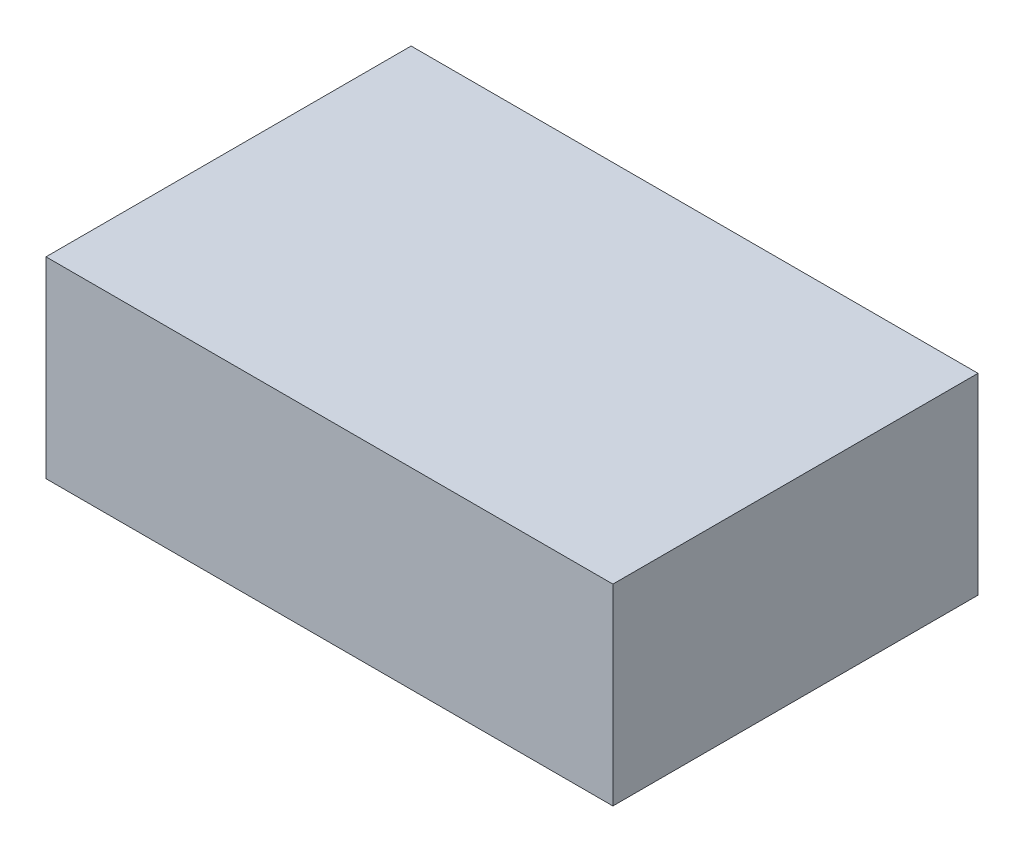
ISO-10303-21;
HEADER;
FILE_DESCRIPTION(('STEP AP214'),'2;1');
FILE_NAME('part.step','',(''),(''),'','','');
FILE_SCHEMA(('AUTOMOTIVE_DESIGN { 1 0 10303 214 1 1 1 1 }'));
ENDSEC;
DATA;
#1=APPLICATION_CONTEXT('core data for automotive mechanical design processes');
#2=APPLICATION_PROTOCOL_DEFINITION('international standard','automotive_design',2000,#1);
#3=PRODUCT_CONTEXT('',#1,'mechanical');
#4=PRODUCT('Part','Part','',(#3));
#5=PRODUCT_RELATED_PRODUCT_CATEGORY('part','',(#4));
#6=PRODUCT_DEFINITION_FORMATION('','',#4);
#7=PRODUCT_DEFINITION_CONTEXT('part definition',#1,'design');
#8=PRODUCT_DEFINITION('design','',#6,#7);
#9=PRODUCT_DEFINITION_SHAPE('','',#8);
#10=(LENGTH_UNIT() NAMED_UNIT(*) SI_UNIT(.MILLI.,.METRE.));
#11=(NAMED_UNIT(*) PLANE_ANGLE_UNIT() SI_UNIT($,.RADIAN.));
#12=(NAMED_UNIT(*) SI_UNIT($,.STERADIAN.) SOLID_ANGLE_UNIT());
#13=UNCERTAINTY_MEASURE_WITH_UNIT(LENGTH_MEASURE(1.E-05),#10,'distance_accuracy_value','');
#14=(GEOMETRIC_REPRESENTATION_CONTEXT(3) GLOBAL_UNCERTAINTY_ASSIGNED_CONTEXT((#13)) GLOBAL_UNIT_ASSIGNED_CONTEXT((#10,
#11,#12)) REPRESENTATION_CONTEXT('',''));
#15=CARTESIAN_POINT('',(0.,0.,0.));
#16=DIRECTION('',(0.,0.,1.));
#17=DIRECTION('',(1.,0.,0.));
#18=AXIS2_PLACEMENT_3D('',#15,#16,#17);
#19=CARTESIAN_POINT('',(746.125,-254.,-838.2));
#20=DIRECTION('',(0.,0.,-1.));
#21=DIRECTION('',(-1.,0.,0.));
#22=AXIS2_PLACEMENT_3D('',#19,#20,#21);
#23=PLANE('',#22);
#24=DIRECTION('',(-1.,0.,0.));
#25=VECTOR('',#24,1.);
#26=CARTESIAN_POINT('',(746.125,-254.,-838.2));
#27=LINE('',#26,#25);
#28=CARTESIAN_POINT('',(746.125,-254.,-838.2));
#29=VERTEX_POINT('',#28);
#30=CARTESIAN_POINT('',(-746.125,-254.,-838.2));
#31=VERTEX_POINT('',#30);
#32=EDGE_CURVE('E34',#29,#31,#27,.T.);
#33=ORIENTED_EDGE('',*,*,#32,.F.);
#34=DIRECTION('',(0.,1.,0.));
#35=VECTOR('',#34,1.);
#36=CARTESIAN_POINT('',(746.125,-254.,-838.2));
#37=LINE('',#36,#35);
#38=CARTESIAN_POINT('',(746.125,-250.825,-838.2));
#39=VERTEX_POINT('',#38);
#40=EDGE_CURVE('E10',#29,#39,#37,.T.);
#41=ORIENTED_EDGE('',*,*,#40,.T.);
#42=DIRECTION('',(1.,0.,0.));
#43=VECTOR('',#42,1.);
#44=CARTESIAN_POINT('',(-746.125,-250.825,-838.2));
#45=LINE('',#44,#43);
#46=CARTESIAN_POINT('',(-746.125,-250.825,-838.2));
#47=VERTEX_POINT('',#46);
#48=EDGE_CURVE('E138',#47,#39,#45,.T.);
#49=ORIENTED_EDGE('',*,*,#48,.F.);
#50=DIRECTION('',(0.,1.,0.));
#51=VECTOR('',#50,1.);
#52=CARTESIAN_POINT('',(-746.125,-254.,-838.2));
#53=LINE('',#52,#51);
#54=EDGE_CURVE('E141',#31,#47,#53,.T.);
#55=ORIENTED_EDGE('',*,*,#54,.F.);
#56=EDGE_LOOP('',(#33,#41,#49,#55));
#57=FACE_BOUND('',#56,.T.);
#58=ADVANCED_FACE('F16',(#57),#23,.F.);
#59=CARTESIAN_POINT('',(-746.125,-254.,-127.));
#60=DIRECTION('',(0.,0.,1.));
#61=DIRECTION('',(1.,0.,0.));
#62=AXIS2_PLACEMENT_3D('',#59,#60,#61);
#63=PLANE('',#62);
#64=DIRECTION('',(1.,0.,0.));
#65=VECTOR('',#64,1.);
#66=CARTESIAN_POINT('',(-746.125,-254.,-127.));
#67=LINE('',#66,#65);
#68=CARTESIAN_POINT('',(-746.125,-254.,-127.));
#69=VERTEX_POINT('',#68);
#70=CARTESIAN_POINT('',(746.125,-254.,-127.));
#71=VERTEX_POINT('',#70);
#72=EDGE_CURVE('E135',#69,#71,#67,.T.);
#73=ORIENTED_EDGE('',*,*,#72,.F.);
#74=DIRECTION('',(0.,1.,0.));
#75=VECTOR('',#74,1.);
#76=CARTESIAN_POINT('',(-746.125,-254.,-127.));
#77=LINE('',#76,#75);
#78=CARTESIAN_POINT('',(-746.125,-250.825,-127.));
#79=VERTEX_POINT('',#78);
#80=EDGE_CURVE('E26',#69,#79,#77,.T.);
#81=ORIENTED_EDGE('',*,*,#80,.T.);
#82=DIRECTION('',(-1.,0.,0.));
#83=VECTOR('',#82,1.);
#84=CARTESIAN_POINT('',(746.125,-250.825,-127.));
#85=LINE('',#84,#83);
#86=CARTESIAN_POINT('',(746.125,-250.825,-127.));
#87=VERTEX_POINT('',#86);
#88=EDGE_CURVE('E148',#87,#79,#85,.T.);
#89=ORIENTED_EDGE('',*,*,#88,.F.);
#90=DIRECTION('',(0.,1.,0.));
#91=VECTOR('',#90,1.);
#92=CARTESIAN_POINT('',(746.125,-254.,-127.));
#93=LINE('',#92,#91);
#94=EDGE_CURVE('E152',#71,#87,#93,.T.);
#95=ORIENTED_EDGE('',*,*,#94,.F.);
#96=EDGE_LOOP('',(#73,#81,#89,#95));
#97=FACE_BOUND('',#96,.T.);
#98=ADVANCED_FACE('F220',(#97),#63,.F.);
#99=CARTESIAN_POINT('',(749.3,-250.825,0.));
#100=DIRECTION('',(0.,-1.,0.));
#101=DIRECTION('',(0.,0.,-1.));
#102=AXIS2_PLACEMENT_3D('',#99,#100,#101);
#103=PLANE('',#102);
#104=ORIENTED_EDGE('',*,*,#48,.T.);
#105=DIRECTION('',(0.,0.,-1.));
#106=VECTOR('',#105,1.);
#107=CARTESIAN_POINT('',(746.125,-250.825,-838.2));
#108=LINE('',#107,#106);
#109=CARTESIAN_POINT('',(746.125,-250.825,-962.025));
#110=VERTEX_POINT('',#109);
#111=EDGE_CURVE('E140',#39,#110,#108,.T.);
#112=ORIENTED_EDGE('',*,*,#111,.T.);
#113=DIRECTION('',(-1.,0.,0.));
#114=VECTOR('',#113,1.);
#115=CARTESIAN_POINT('',(746.125,-250.825,-962.025));
#116=LINE('',#115,#114);
#117=CARTESIAN_POINT('',(-746.125,-250.825,-962.025));
#118=VERTEX_POINT('',#117);
#119=EDGE_CURVE('E150',#110,#118,#116,.T.);
#120=ORIENTED_EDGE('',*,*,#119,.T.);
#121=DIRECTION('',(0.,0.,-1.));
#122=VECTOR('',#121,1.);
#123=CARTESIAN_POINT('',(-746.125,-250.825,-962.025));
#124=LINE('',#123,#122);
#125=EDGE_CURVE('E144',#47,#118,#124,.T.);
#126=ORIENTED_EDGE('',*,*,#125,.F.);
#127=EDGE_LOOP('',(#104,#112,#120,#126));
#128=FACE_BOUND('',#127,.T.);
#129=ADVANCED_FACE('F225',(#128),#103,.F.);
#130=CARTESIAN_POINT('',(749.3,-250.825,0.));
#131=DIRECTION('',(0.,-1.,0.));
#132=DIRECTION('',(0.,0.,-1.));
#133=AXIS2_PLACEMENT_3D('',#130,#131,#132);
#134=PLANE('',#133);
#135=ORIENTED_EDGE('',*,*,#88,.T.);
#136=DIRECTION('',(0.,0.,-1.));
#137=VECTOR('',#136,1.);
#138=CARTESIAN_POINT('',(-746.125,-250.825,-127.));
#139=LINE('',#138,#137);
#140=CARTESIAN_POINT('',(-746.125,-250.825,-3.175));
#141=VERTEX_POINT('',#140);
#142=EDGE_CURVE('E143',#141,#79,#139,.T.);
#143=ORIENTED_EDGE('',*,*,#142,.F.);
#144=DIRECTION('',(1.,0.,0.));
#145=VECTOR('',#144,1.);
#146=CARTESIAN_POINT('',(746.125,-250.825,-3.175));
#147=LINE('',#146,#145);
#148=CARTESIAN_POINT('',(746.125,-250.825,-3.175));
#149=VERTEX_POINT('',#148);
#150=EDGE_CURVE('E151',#141,#149,#147,.T.);
#151=ORIENTED_EDGE('',*,*,#150,.T.);
#152=DIRECTION('',(0.,0.,-1.));
#153=VECTOR('',#152,1.);
#154=CARTESIAN_POINT('',(746.125,-250.825,-3.175));
#155=LINE('',#154,#153);
#156=EDGE_CURVE('E167',#149,#87,#155,.T.);
#157=ORIENTED_EDGE('',*,*,#156,.T.);
#158=EDGE_LOOP('',(#135,#143,#151,#157));
#159=FACE_BOUND('',#158,.T.);
#160=ADVANCED_FACE('F231',(#159),#134,.F.);
#161=CARTESIAN_POINT('',(746.125,254.,0.));
#162=DIRECTION('',(1.,0.,0.));
#163=DIRECTION('',(0.,0.,-1.));
#164=AXIS2_PLACEMENT_3D('',#161,#162,#163);
#165=PLANE('',#164);
#166=DIRECTION('',(0.,1.,0.));
#167=VECTOR('',#166,1.);
#168=CARTESIAN_POINT('',(746.125,250.825,-3.175));
#169=LINE('',#168,#167);
#170=CARTESIAN_POINT('',(746.125,250.825,-3.175));
#171=VERTEX_POINT('',#170);
#172=EDGE_CURVE('E170',#149,#171,#169,.T.);
#173=ORIENTED_EDGE('',*,*,#172,.T.);
#174=DIRECTION('',(0.,0.,-1.));
#175=VECTOR('',#174,1.);
#176=CARTESIAN_POINT('',(746.125,250.825,-962.025));
#177=LINE('',#176,#175);
#178=CARTESIAN_POINT('',(746.125,250.825,-962.025));
#179=VERTEX_POINT('',#178);
#180=EDGE_CURVE('E173',#171,#179,#177,.T.);
#181=ORIENTED_EDGE('',*,*,#180,.T.);
#182=DIRECTION('',(0.,-1.,0.));
#183=VECTOR('',#182,1.);
#184=CARTESIAN_POINT('',(746.125,250.825,-962.025));
#185=LINE('',#184,#183);
#186=EDGE_CURVE('E154',#179,#110,#185,.T.);
#187=ORIENTED_EDGE('',*,*,#186,.T.);
#188=ORIENTED_EDGE('',*,*,#111,.F.);
#189=ORIENTED_EDGE('',*,*,#40,.F.);
#190=DIRECTION('',(0.,0.,-1.));
#191=VECTOR('',#190,1.);
#192=CARTESIAN_POINT('',(746.125,-254.,-127.));
#193=LINE('',#192,#191);
#194=EDGE_CURVE('E131',#71,#29,#193,.T.);
#195=ORIENTED_EDGE('',*,*,#194,.F.);
#196=ORIENTED_EDGE('',*,*,#94,.T.);
#197=ORIENTED_EDGE('',*,*,#156,.F.);
#198=EDGE_LOOP('',(#173,#181,#187,#188,#189,#195,#196,#197));
#199=FACE_BOUND('',#198,.T.);
#200=ADVANCED_FACE('F235',(#199),#165,.F.);
#201=CARTESIAN_POINT('',(-749.3,250.825,0.));
#202=DIRECTION('',(0.,1.,0.));
#203=DIRECTION('',(0.,0.,1.));
#204=AXIS2_PLACEMENT_3D('',#201,#202,#203);
#205=PLANE('',#204);
#206=DIRECTION('',(-1.,0.,0.));
#207=VECTOR('',#206,1.);
#208=CARTESIAN_POINT('',(-746.125,250.825,-3.175));
#209=LINE('',#208,#207);
#210=CARTESIAN_POINT('',(-746.125,250.825,-3.175));
#211=VERTEX_POINT('',#210);
#212=EDGE_CURVE('E155',#171,#211,#209,.T.);
#213=ORIENTED_EDGE('',*,*,#212,.T.);
#214=DIRECTION('',(0.,0.,-1.));
#215=VECTOR('',#214,1.);
#216=CARTESIAN_POINT('',(-746.125,250.825,-962.025));
#217=LINE('',#216,#215);
#218=CARTESIAN_POINT('',(-746.125,250.825,-962.025));
#219=VERTEX_POINT('',#218);
#220=EDGE_CURVE('E180',#211,#219,#217,.T.);
#221=ORIENTED_EDGE('',*,*,#220,.T.);
#222=DIRECTION('',(1.,0.,0.));
#223=VECTOR('',#222,1.);
#224=CARTESIAN_POINT('',(-746.125,250.825,-962.025));
#225=LINE('',#224,#223);
#226=EDGE_CURVE('E183',#219,#179,#225,.T.);
#227=ORIENTED_EDGE('',*,*,#226,.T.);
#228=ORIENTED_EDGE('',*,*,#180,.F.);
#229=EDGE_LOOP('',(#213,#221,#227,#228));
#230=FACE_BOUND('',#229,.T.);
#231=ADVANCED_FACE('F239',(#230),#205,.F.);
#232=CARTESIAN_POINT('',(-746.125,-254.,0.));
#233=DIRECTION('',(-1.,0.,0.));
#234=DIRECTION('',(0.,0.,1.));
#235=AXIS2_PLACEMENT_3D('',#232,#233,#234);
#236=PLANE('',#235);
#237=DIRECTION('',(0.,-1.,0.));
#238=VECTOR('',#237,1.);
#239=CARTESIAN_POINT('',(-746.125,-250.825,-3.175));
#240=LINE('',#239,#238);
#241=EDGE_CURVE('E164',#211,#141,#240,.T.);
#242=ORIENTED_EDGE('',*,*,#241,.T.);
#243=ORIENTED_EDGE('',*,*,#142,.T.);
#244=ORIENTED_EDGE('',*,*,#80,.F.);
#245=DIRECTION('',(0.,0.,1.));
#246=VECTOR('',#245,1.);
#247=CARTESIAN_POINT('',(-746.125,-254.,-838.2));
#248=LINE('',#247,#246);
#249=EDGE_CURVE('E126',#31,#69,#248,.T.);
#250=ORIENTED_EDGE('',*,*,#249,.F.);
#251=ORIENTED_EDGE('',*,*,#54,.T.);
#252=ORIENTED_EDGE('',*,*,#125,.T.);
#253=DIRECTION('',(0.,1.,0.));
#254=VECTOR('',#253,1.);
#255=CARTESIAN_POINT('',(-746.125,-250.825,-962.025));
#256=LINE('',#255,#254);
#257=EDGE_CURVE('E161',#118,#219,#256,.T.);
#258=ORIENTED_EDGE('',*,*,#257,.T.);
#259=ORIENTED_EDGE('',*,*,#220,.F.);
#260=EDGE_LOOP('',(#242,#243,#244,#250,#251,#252,#258,#259));
#261=FACE_BOUND('',#260,.T.);
#262=ADVANCED_FACE('F243',(#261),#236,.F.);
#263=CARTESIAN_POINT('',(0.,0.,-962.025));
#264=DIRECTION('',(0.,0.,1.));
#265=DIRECTION('',(1.,0.,0.));
#266=AXIS2_PLACEMENT_3D('',#263,#264,#265);
#267=PLANE('',#266);
#268=ORIENTED_EDGE('',*,*,#119,.F.);
#269=ORIENTED_EDGE('',*,*,#186,.F.);
#270=ORIENTED_EDGE('',*,*,#226,.F.);
#271=ORIENTED_EDGE('',*,*,#257,.F.);
#272=EDGE_LOOP('',(#268,#269,#270,#271));
#273=FACE_BOUND('',#272,.T.);
#274=ADVANCED_FACE('F247',(#273),#267,.T.);
#275=CARTESIAN_POINT('',(0.,0.,-3.175));
#276=DIRECTION('',(0.,0.,1.));
#277=DIRECTION('',(1.,0.,0.));
#278=AXIS2_PLACEMENT_3D('',#275,#276,#277);
#279=PLANE('',#278);
#280=ORIENTED_EDGE('',*,*,#150,.F.);
#281=ORIENTED_EDGE('',*,*,#241,.F.);
#282=ORIENTED_EDGE('',*,*,#212,.F.);
#283=ORIENTED_EDGE('',*,*,#172,.F.);
#284=EDGE_LOOP('',(#280,#281,#282,#283));
#285=FACE_BOUND('',#284,.T.);
#286=ADVANCED_FACE('F217',(#285),#279,.F.);
#287=CARTESIAN_POINT('',(749.3,254.,0.));
#288=DIRECTION('',(1.,0.,0.));
#289=DIRECTION('',(0.,0.,-1.));
#290=AXIS2_PLACEMENT_3D('',#287,#288,#289);
#291=PLANE('',#290);
#292=DIRECTION('',(0.,1.,0.));
#293=VECTOR('',#292,1.);
#294=CARTESIAN_POINT('',(749.3,-254.,0.));
#295=LINE('',#294,#293);
#296=CARTESIAN_POINT('',(749.3,-254.,0.));
#297=VERTEX_POINT('',#296);
#298=CARTESIAN_POINT('',(749.3,254.,0.));
#299=VERTEX_POINT('',#298);
#300=EDGE_CURVE('E192',#297,#299,#295,.T.);
#301=ORIENTED_EDGE('',*,*,#300,.F.);
#302=DIRECTION('',(0.,0.,-1.));
#303=VECTOR('',#302,1.);
#304=CARTESIAN_POINT('',(749.3,-254.,0.));
#305=LINE('',#304,#303);
#306=CARTESIAN_POINT('',(749.3,-254.,-965.2));
#307=VERTEX_POINT('',#306);
#308=EDGE_CURVE('E191',#297,#307,#305,.T.);
#309=ORIENTED_EDGE('',*,*,#308,.T.);
#310=DIRECTION('',(0.,-1.,0.));
#311=VECTOR('',#310,1.);
#312=CARTESIAN_POINT('',(749.3,254.,-965.2));
#313=LINE('',#312,#311);
#314=CARTESIAN_POINT('',(749.3,254.,-965.2));
#315=VERTEX_POINT('',#314);
#316=EDGE_CURVE('E129',#315,#307,#313,.T.);
#317=ORIENTED_EDGE('',*,*,#316,.F.);
#318=DIRECTION('',(0.,0.,-1.));
#319=VECTOR('',#318,1.);
#320=CARTESIAN_POINT('',(749.3,254.,0.));
#321=LINE('',#320,#319);
#322=EDGE_CURVE('E196',#299,#315,#321,.T.);
#323=ORIENTED_EDGE('',*,*,#322,.F.);
#324=EDGE_LOOP('',(#301,#309,#317,#323));
#325=FACE_BOUND('',#324,.T.);
#326=ADVANCED_FACE('F206',(#325),#291,.T.);
#327=CARTESIAN_POINT('',(-749.3,254.,0.));
#328=DIRECTION('',(0.,1.,0.));
#329=DIRECTION('',(0.,0.,1.));
#330=AXIS2_PLACEMENT_3D('',#327,#328,#329);
#331=PLANE('',#330);
#332=DIRECTION('',(-1.,0.,0.));
#333=VECTOR('',#332,1.);
#334=CARTESIAN_POINT('',(749.3,254.,0.));
#335=LINE('',#334,#333);
#336=CARTESIAN_POINT('',(-749.3,254.,0.));
#337=VERTEX_POINT('',#336);
#338=EDGE_CURVE('E194',#299,#337,#335,.T.);
#339=ORIENTED_EDGE('',*,*,#338,.F.);
#340=ORIENTED_EDGE('',*,*,#322,.T.);
#341=DIRECTION('',(1.,0.,0.));
#342=VECTOR('',#341,1.);
#343=CARTESIAN_POINT('',(-749.3,254.,-965.2));
#344=LINE('',#343,#342);
#345=CARTESIAN_POINT('',(-749.3,254.,-965.2));
#346=VERTEX_POINT('',#345);
#347=EDGE_CURVE('E118',#346,#315,#344,.T.);
#348=ORIENTED_EDGE('',*,*,#347,.F.);
#349=DIRECTION('',(0.,0.,-1.));
#350=VECTOR('',#349,1.);
#351=CARTESIAN_POINT('',(-749.3,254.,0.));
#352=LINE('',#351,#350);
#353=EDGE_CURVE('E114',#337,#346,#352,.T.);
#354=ORIENTED_EDGE('',*,*,#353,.F.);
#355=EDGE_LOOP('',(#339,#340,#348,#354));
#356=FACE_BOUND('',#355,.T.);
#357=ADVANCED_FACE('F208',(#356),#331,.T.);
#358=CARTESIAN_POINT('',(-749.3,-254.,0.));
#359=DIRECTION('',(-1.,0.,0.));
#360=DIRECTION('',(0.,0.,1.));
#361=AXIS2_PLACEMENT_3D('',#358,#359,#360);
#362=PLANE('',#361);
#363=DIRECTION('',(0.,-1.,0.));
#364=VECTOR('',#363,1.);
#365=CARTESIAN_POINT('',(-749.3,254.,0.));
#366=LINE('',#365,#364);
#367=CARTESIAN_POINT('',(-749.3,-254.,0.));
#368=VERTEX_POINT('',#367);
#369=EDGE_CURVE('E102',#337,#368,#366,.T.);
#370=ORIENTED_EDGE('',*,*,#369,.F.);
#371=ORIENTED_EDGE('',*,*,#353,.T.);
#372=DIRECTION('',(0.,1.,0.));
#373=VECTOR('',#372,1.);
#374=CARTESIAN_POINT('',(-749.3,-254.,-965.2));
#375=LINE('',#374,#373);
#376=CARTESIAN_POINT('',(-749.3,-254.,-965.2));
#377=VERTEX_POINT('',#376);
#378=EDGE_CURVE('E108',#377,#346,#375,.T.);
#379=ORIENTED_EDGE('',*,*,#378,.F.);
#380=DIRECTION('',(0.,0.,-1.));
#381=VECTOR('',#380,1.);
#382=CARTESIAN_POINT('',(-749.3,-254.,0.));
#383=LINE('',#382,#381);
#384=EDGE_CURVE('E111',#368,#377,#383,.T.);
#385=ORIENTED_EDGE('',*,*,#384,.F.);
#386=EDGE_LOOP('',(#370,#371,#379,#385));
#387=FACE_BOUND('',#386,.T.);
#388=ADVANCED_FACE('F110',(#387),#362,.T.);
#389=CARTESIAN_POINT('',(749.3,-254.,0.));
#390=DIRECTION('',(0.,-1.,0.));
#391=DIRECTION('',(0.,0.,-1.));
#392=AXIS2_PLACEMENT_3D('',#389,#390,#391);
#393=PLANE('',#392);
#394=DIRECTION('',(1.,0.,0.));
#395=VECTOR('',#394,1.);
#396=CARTESIAN_POINT('',(-749.3,-254.,0.));
#397=LINE('',#396,#395);
#398=EDGE_CURVE('E125',#368,#297,#397,.T.);
#399=ORIENTED_EDGE('',*,*,#398,.F.);
#400=ORIENTED_EDGE('',*,*,#384,.T.);
#401=DIRECTION('',(-1.,0.,0.));
#402=VECTOR('',#401,1.);
#403=CARTESIAN_POINT('',(749.3,-254.,-965.2));
#404=LINE('',#403,#402);
#405=EDGE_CURVE('E20',#307,#377,#404,.T.);
#406=ORIENTED_EDGE('',*,*,#405,.F.);
#407=ORIENTED_EDGE('',*,*,#308,.F.);
#408=EDGE_LOOP('',(#399,#400,#406,#407));
#409=FACE_BOUND('',#408,.T.);
#410=ORIENTED_EDGE('',*,*,#249,.T.);
#411=ORIENTED_EDGE('',*,*,#72,.T.);
#412=ORIENTED_EDGE('',*,*,#194,.T.);
#413=ORIENTED_EDGE('',*,*,#32,.T.);
#414=EDGE_LOOP('',(#410,#411,#412,#413));
#415=FACE_BOUND('',#414,.T.);
#416=ADVANCED_FACE('F122',(#409,#415),#393,.T.);
#417=CARTESIAN_POINT('',(0.,0.,-965.2));
#418=DIRECTION('',(0.,0.,1.));
#419=DIRECTION('',(1.,0.,0.));
#420=AXIS2_PLACEMENT_3D('',#417,#418,#419);
#421=PLANE('',#420);
#422=ORIENTED_EDGE('',*,*,#405,.T.);
#423=ORIENTED_EDGE('',*,*,#378,.T.);
#424=ORIENTED_EDGE('',*,*,#347,.T.);
#425=ORIENTED_EDGE('',*,*,#316,.T.);
#426=EDGE_LOOP('',(#422,#423,#424,#425));
#427=FACE_BOUND('',#426,.T.);
#428=ADVANCED_FACE('F128',(#427),#421,.F.);
#429=CARTESIAN_POINT('',(0.,0.,0.));
#430=DIRECTION('',(0.,0.,1.));
#431=DIRECTION('',(1.,0.,0.));
#432=AXIS2_PLACEMENT_3D('',#429,#430,#431);
#433=PLANE('',#432);
#434=ORIENTED_EDGE('',*,*,#398,.T.);
#435=ORIENTED_EDGE('',*,*,#300,.T.);
#436=ORIENTED_EDGE('',*,*,#338,.T.);
#437=ORIENTED_EDGE('',*,*,#369,.T.);
#438=EDGE_LOOP('',(#434,#435,#436,#437));
#439=FACE_BOUND('',#438,.T.);
#440=ADVANCED_FACE('F18',(#439),#433,.T.);
#441=CLOSED_SHELL('',(#58,#98,#129,#160,#200,#231,#262,#274,#286,#326,#357,#388,#416,#428,#440));
#442=MANIFOLD_SOLID_BREP('B1',#441);
#443=ADVANCED_BREP_SHAPE_REPRESENTATION('',(#18,#442),#14);
#444=SHAPE_DEFINITION_REPRESENTATION(#9,#443);
ENDSEC;
END-ISO-10303-21;
